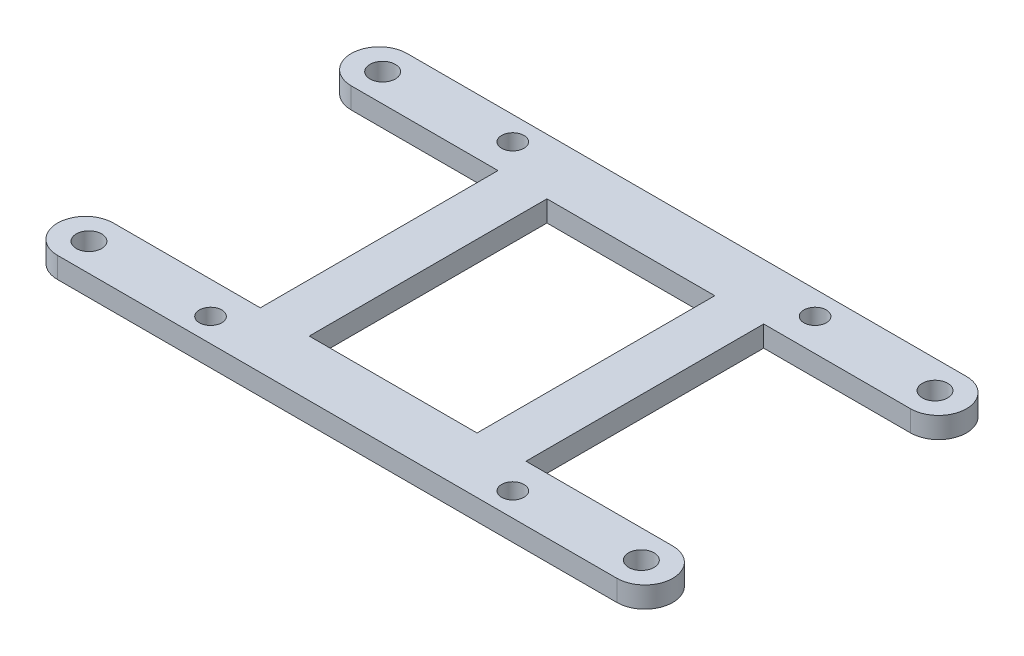
ISO-10303-21;
HEADER;
FILE_DESCRIPTION(('STEP AP214'),'2;1');
FILE_NAME('part.step','',(''),(''),'','','');
FILE_SCHEMA(('AUTOMOTIVE_DESIGN { 1 0 10303 214 1 1 1 1 }'));
ENDSEC;
DATA;
#1=APPLICATION_CONTEXT('core data for automotive mechanical design processes');
#2=APPLICATION_PROTOCOL_DEFINITION('international standard','automotive_design',2000,#1);
#3=PRODUCT_CONTEXT('',#1,'mechanical');
#4=PRODUCT('Part','Part','',(#3));
#5=PRODUCT_RELATED_PRODUCT_CATEGORY('part','',(#4));
#6=PRODUCT_DEFINITION_FORMATION('','',#4);
#7=PRODUCT_DEFINITION_CONTEXT('part definition',#1,'design');
#8=PRODUCT_DEFINITION('design','',#6,#7);
#9=PRODUCT_DEFINITION_SHAPE('','',#8);
#10=(LENGTH_UNIT() NAMED_UNIT(*) SI_UNIT(.MILLI.,.METRE.));
#11=(NAMED_UNIT(*) PLANE_ANGLE_UNIT() SI_UNIT($,.RADIAN.));
#12=(NAMED_UNIT(*) SI_UNIT($,.STERADIAN.) SOLID_ANGLE_UNIT());
#13=UNCERTAINTY_MEASURE_WITH_UNIT(LENGTH_MEASURE(1.E-05),#10,'distance_accuracy_value','');
#14=(GEOMETRIC_REPRESENTATION_CONTEXT(3) GLOBAL_UNCERTAINTY_ASSIGNED_CONTEXT((#13)) GLOBAL_UNIT_ASSIGNED_CONTEXT((#10,
#11,#12)) REPRESENTATION_CONTEXT('',''));
#15=CARTESIAN_POINT('',(0.,0.,0.));
#16=DIRECTION('',(0.,0.,1.));
#17=DIRECTION('',(1.,0.,0.));
#18=AXIS2_PLACEMENT_3D('',#15,#16,#17);
#19=CARTESIAN_POINT('',(12.,3.,0.));
#20=DIRECTION('',(-1.,0.,0.));
#21=DIRECTION('',(0.,0.,1.));
#22=AXIS2_PLACEMENT_3D('',#19,#20,#21);
#23=PLANE('',#22);
#24=DIRECTION('',(0.,0.,-1.));
#25=VECTOR('',#24,1.);
#26=CARTESIAN_POINT('',(12.,0.,0.));
#27=LINE('',#26,#25);
#28=CARTESIAN_POINT('',(12.0000000000001,0.,16.9999999999999));
#29=VERTEX_POINT('',#28);
#30=CARTESIAN_POINT('',(11.9999999999999,0.,-17.0000000000001));
#31=VERTEX_POINT('',#30);
#32=EDGE_CURVE('E251',#29,#31,#27,.T.);
#33=ORIENTED_EDGE('',*,*,#32,.F.);
#34=DIRECTION('',(0.,-1.,0.));
#35=VECTOR('',#34,1.);
#36=CARTESIAN_POINT('',(12.0000000000001,3.,16.9999999999999));
#37=LINE('',#36,#35);
#38=CARTESIAN_POINT('',(12.0000000000001,3.,16.9999999999999));
#39=VERTEX_POINT('',#38);
#40=EDGE_CURVE('E11',#39,#29,#37,.T.);
#41=ORIENTED_EDGE('',*,*,#40,.F.);
#42=DIRECTION('',(0.,0.,-1.));
#43=VECTOR('',#42,1.);
#44=CARTESIAN_POINT('',(12.,3.,0.));
#45=LINE('',#44,#43);
#46=CARTESIAN_POINT('',(11.9999999999999,3.,-17.0000000000001));
#47=VERTEX_POINT('',#46);
#48=EDGE_CURVE('E183',#39,#47,#45,.T.);
#49=ORIENTED_EDGE('',*,*,#48,.T.);
#50=DIRECTION('',(0.,-1.,0.));
#51=VECTOR('',#50,1.);
#52=CARTESIAN_POINT('',(11.9999999999999,3.,-17.0000000000001));
#53=LINE('',#52,#51);
#54=EDGE_CURVE('E121',#47,#31,#53,.T.);
#55=ORIENTED_EDGE('',*,*,#54,.T.);
#56=EDGE_LOOP('',(#33,#41,#49,#55));
#57=FACE_BOUND('',#56,.T.);
#58=ADVANCED_FACE('F43',(#57),#23,.T.);
#59=CARTESIAN_POINT('',(1.17961196366423E-13,3.,17.));
#60=DIRECTION('',(0.,0.,-1.));
#61=DIRECTION('',(-1.,0.,0.));
#62=AXIS2_PLACEMENT_3D('',#59,#60,#61);
#63=PLANE('',#62);
#64=DIRECTION('',(1.,0.,0.));
#65=VECTOR('',#64,1.);
#66=CARTESIAN_POINT('',(1.17961196366423E-13,0.,17.));
#67=LINE('',#66,#65);
#68=CARTESIAN_POINT('',(-11.9999999999999,0.,17.0000000000001));
#69=VERTEX_POINT('',#68);
#70=EDGE_CURVE('E173',#69,#29,#67,.T.);
#71=ORIENTED_EDGE('',*,*,#70,.F.);
#72=DIRECTION('',(0.,-1.,0.));
#73=VECTOR('',#72,1.);
#74=CARTESIAN_POINT('',(-11.9999999999999,3.,17.0000000000001));
#75=LINE('',#74,#73);
#76=CARTESIAN_POINT('',(-11.9999999999999,3.,17.0000000000001));
#77=VERTEX_POINT('',#76);
#78=EDGE_CURVE('E53',#77,#69,#75,.T.);
#79=ORIENTED_EDGE('',*,*,#78,.F.);
#80=DIRECTION('',(1.,0.,0.));
#81=VECTOR('',#80,1.);
#82=CARTESIAN_POINT('',(1.17961196366423E-13,3.,17.));
#83=LINE('',#82,#81);
#84=EDGE_CURVE('E171',#77,#39,#83,.T.);
#85=ORIENTED_EDGE('',*,*,#84,.T.);
#86=ORIENTED_EDGE('',*,*,#40,.T.);
#87=EDGE_LOOP('',(#71,#79,#85,#86));
#88=FACE_BOUND('',#87,.T.);
#89=ADVANCED_FACE('F169',(#88),#63,.T.);
#90=CARTESIAN_POINT('',(-11.9999999999999,3.,0.));
#91=DIRECTION('',(-1.,0.,0.));
#92=DIRECTION('',(0.,0.,1.));
#93=AXIS2_PLACEMENT_3D('',#90,#91,#92);
#94=PLANE('',#93);
#95=DIRECTION('',(0.,0.,-1.));
#96=VECTOR('',#95,1.);
#97=CARTESIAN_POINT('',(-11.9999999999999,0.,0.));
#98=LINE('',#97,#96);
#99=CARTESIAN_POINT('',(-12.,0.,-17.));
#100=VERTEX_POINT('',#99);
#101=EDGE_CURVE('E254',#69,#100,#98,.T.);
#102=ORIENTED_EDGE('',*,*,#101,.T.);
#103=DIRECTION('',(0.,-1.,0.));
#104=VECTOR('',#103,1.);
#105=CARTESIAN_POINT('',(-12.,3.,-17.));
#106=LINE('',#105,#104);
#107=CARTESIAN_POINT('',(-12.,3.,-17.));
#108=VERTEX_POINT('',#107);
#109=EDGE_CURVE('E176',#108,#100,#106,.T.);
#110=ORIENTED_EDGE('',*,*,#109,.F.);
#111=DIRECTION('',(0.,0.,-1.));
#112=VECTOR('',#111,1.);
#113=CARTESIAN_POINT('',(-11.9999999999999,3.,0.));
#114=LINE('',#113,#112);
#115=EDGE_CURVE('E179',#77,#108,#114,.T.);
#116=ORIENTED_EDGE('',*,*,#115,.F.);
#117=ORIENTED_EDGE('',*,*,#78,.T.);
#118=EDGE_LOOP('',(#102,#110,#116,#117));
#119=FACE_BOUND('',#118,.T.);
#120=ADVANCED_FACE('F180',(#119),#94,.F.);
#121=CARTESIAN_POINT('',(-40.000000000001,3.,21.0000000000001));
#122=DIRECTION('',(0.,-1.,0.));
#123=DIRECTION('',(0.,0.,-1.));
#124=AXIS2_PLACEMENT_3D('',#121,#122,#123);
#125=CYLINDRICAL_SURFACE('',#124,4.00000000000006);
#126=CARTESIAN_POINT('',(-40.000000000001,0.,21.0000000000001));
#127=DIRECTION('',(0.,1.,0.));
#128=DIRECTION('',(0.,0.,1.));
#129=AXIS2_PLACEMENT_3D('',#126,#127,#128);
#130=CIRCLE('',#129,4.00000000000006);
#131=CARTESIAN_POINT('',(-40.0000000000012,0.,24.9999999999998));
#132=VERTEX_POINT('',#131);
#133=CARTESIAN_POINT('',(-40.000000000001,0.,16.9999999999997));
#134=VERTEX_POINT('',#133);
#135=EDGE_CURVE('E215',#132,#134,#130,.F.);
#136=ORIENTED_EDGE('',*,*,#135,.F.);
#137=DIRECTION('',(0.,-1.,0.));
#138=VECTOR('',#137,1.);
#139=CARTESIAN_POINT('',(-40.0000000000012,3.,24.9999999999998));
#140=LINE('',#139,#138);
#141=CARTESIAN_POINT('',(-40.0000000000012,3.,24.9999999999998));
#142=VERTEX_POINT('',#141);
#143=EDGE_CURVE('E47',#142,#132,#140,.T.);
#144=ORIENTED_EDGE('',*,*,#143,.F.);
#145=CARTESIAN_POINT('',(-40.000000000001,3.,21.0000000000001));
#146=DIRECTION('',(0.,1.,0.));
#147=DIRECTION('',(0.,0.,1.));
#148=AXIS2_PLACEMENT_3D('',#145,#146,#147);
#149=CIRCLE('',#148,4.00000000000006);
#150=CARTESIAN_POINT('',(-40.000000000001,3.,16.9999999999997));
#151=VERTEX_POINT('',#150);
#152=EDGE_CURVE('E294',#142,#151,#149,.F.);
#153=ORIENTED_EDGE('',*,*,#152,.T.);
#154=DIRECTION('',(0.,-1.,0.));
#155=VECTOR('',#154,1.);
#156=CARTESIAN_POINT('',(-40.000000000001,3.,16.9999999999997));
#157=LINE('',#156,#155);
#158=EDGE_CURVE('E190',#151,#134,#157,.T.);
#159=ORIENTED_EDGE('',*,*,#158,.T.);
#160=EDGE_LOOP('',(#136,#144,#153,#159));
#161=FACE_BOUND('',#160,.T.);
#162=ADVANCED_FACE('F293',(#161),#125,.T.);
#163=CARTESIAN_POINT('',(-2.14775287501877E-13,3.,25.0000000000002));
#164=DIRECTION('',(0.,0.,-1.));
#165=DIRECTION('',(-1.,0.,0.));
#166=AXIS2_PLACEMENT_3D('',#163,#164,#165);
#167=PLANE('',#166);
#168=DIRECTION('',(1.,0.,0.));
#169=VECTOR('',#168,1.);
#170=CARTESIAN_POINT('',(-2.14775287501877E-13,0.,25.0000000000002));
#171=LINE('',#170,#169);
#172=CARTESIAN_POINT('',(40.0000000000012,0.,24.9999999999998));
#173=VERTEX_POINT('',#172);
#174=EDGE_CURVE('E218',#132,#173,#171,.T.);
#175=ORIENTED_EDGE('',*,*,#174,.T.);
#176=DIRECTION('',(0.,-1.,0.));
#177=VECTOR('',#176,1.);
#178=CARTESIAN_POINT('',(40.0000000000012,3.,24.9999999999998));
#179=LINE('',#178,#177);
#180=CARTESIAN_POINT('',(40.0000000000012,3.,24.9999999999998));
#181=VERTEX_POINT('',#180);
#182=EDGE_CURVE('E280',#181,#173,#179,.T.);
#183=ORIENTED_EDGE('',*,*,#182,.F.);
#184=DIRECTION('',(1.,0.,0.));
#185=VECTOR('',#184,1.);
#186=CARTESIAN_POINT('',(-2.14775287501877E-13,3.,25.0000000000002));
#187=LINE('',#186,#185);
#188=EDGE_CURVE('E288',#142,#181,#187,.T.);
#189=ORIENTED_EDGE('',*,*,#188,.F.);
#190=ORIENTED_EDGE('',*,*,#143,.T.);
#191=EDGE_LOOP('',(#175,#183,#189,#190));
#192=FACE_BOUND('',#191,.T.);
#193=ADVANCED_FACE('F286',(#192),#167,.F.);
#194=CARTESIAN_POINT('',(40.000000000001,3.,21.0000000000001));
#195=DIRECTION('',(0.,-1.,0.));
#196=DIRECTION('',(0.,0.,-1.));
#197=AXIS2_PLACEMENT_3D('',#194,#195,#196);
#198=CYLINDRICAL_SURFACE('',#197,4.00000000000006);
#199=CARTESIAN_POINT('',(40.000000000001,0.,21.0000000000001));
#200=DIRECTION('',(0.,1.,0.));
#201=DIRECTION('',(0.,0.,1.));
#202=AXIS2_PLACEMENT_3D('',#199,#200,#201);
#203=CIRCLE('',#202,4.00000000000006);
#204=CARTESIAN_POINT('',(40.000000000001,0.,16.9999999999997));
#205=VERTEX_POINT('',#204);
#206=EDGE_CURVE('E221',#173,#205,#203,.T.);
#207=ORIENTED_EDGE('',*,*,#206,.T.);
#208=DIRECTION('',(0.,-1.,0.));
#209=VECTOR('',#208,1.);
#210=CARTESIAN_POINT('',(40.000000000001,3.,16.9999999999997));
#211=LINE('',#210,#209);
#212=CARTESIAN_POINT('',(40.000000000001,3.,16.9999999999997));
#213=VERTEX_POINT('',#212);
#214=EDGE_CURVE('E279',#213,#205,#211,.T.);
#215=ORIENTED_EDGE('',*,*,#214,.F.);
#216=CARTESIAN_POINT('',(40.000000000001,3.,21.0000000000001));
#217=DIRECTION('',(0.,1.,0.));
#218=DIRECTION('',(0.,0.,1.));
#219=AXIS2_PLACEMENT_3D('',#216,#217,#218);
#220=CIRCLE('',#219,4.00000000000006);
#221=EDGE_CURVE('E691',#181,#213,#220,.T.);
#222=ORIENTED_EDGE('',*,*,#221,.F.);
#223=ORIENTED_EDGE('',*,*,#182,.T.);
#224=EDGE_LOOP('',(#207,#215,#222,#223));
#225=FACE_BOUND('',#224,.T.);
#226=ADVANCED_FACE('F344',(#225),#198,.T.);
#227=CARTESIAN_POINT('',(-3.3984058953181E-13,3.,16.9999999999989));
#228=DIRECTION('',(0.,0.,-1.));
#229=DIRECTION('',(-1.,0.,0.));
#230=AXIS2_PLACEMENT_3D('',#227,#228,#229);
#231=PLANE('',#230);
#232=DIRECTION('',(1.,0.,0.));
#233=VECTOR('',#232,1.);
#234=CARTESIAN_POINT('',(-3.3984058953181E-13,0.,16.9999999999989));
#235=LINE('',#234,#233);
#236=CARTESIAN_POINT('',(19.0000000000006,0.,16.9999999999993));
#237=VERTEX_POINT('',#236);
#238=EDGE_CURVE('E224',#237,#205,#235,.T.);
#239=ORIENTED_EDGE('',*,*,#238,.F.);
#240=DIRECTION('',(0.,-1.,0.));
#241=VECTOR('',#240,1.);
#242=CARTESIAN_POINT('',(19.0000000000006,3.,16.9999999999993));
#243=LINE('',#242,#241);
#244=CARTESIAN_POINT('',(19.0000000000006,3.,16.9999999999993));
#245=VERTEX_POINT('',#244);
#246=EDGE_CURVE('E277',#245,#237,#243,.T.);
#247=ORIENTED_EDGE('',*,*,#246,.F.);
#248=DIRECTION('',(1.,0.,0.));
#249=VECTOR('',#248,1.);
#250=CARTESIAN_POINT('',(-3.3984058953181E-13,3.,16.9999999999989));
#251=LINE('',#250,#249);
#252=EDGE_CURVE('E342',#245,#213,#251,.T.);
#253=ORIENTED_EDGE('',*,*,#252,.T.);
#254=ORIENTED_EDGE('',*,*,#214,.T.);
#255=EDGE_LOOP('',(#239,#247,#253,#254));
#256=FACE_BOUND('',#255,.T.);
#257=ADVANCED_FACE('F341',(#256),#231,.T.);
#258=CARTESIAN_POINT('',(19.0000000000006,3.,0.));
#259=DIRECTION('',(-1.,0.,0.));
#260=DIRECTION('',(0.,0.,1.));
#261=AXIS2_PLACEMENT_3D('',#258,#259,#260);
#262=PLANE('',#261);
#263=DIRECTION('',(0.,0.,-1.));
#264=VECTOR('',#263,1.);
#265=CARTESIAN_POINT('',(19.0000000000006,0.,0.));
#266=LINE('',#265,#264);
#267=CARTESIAN_POINT('',(19.0000000000006,0.,-17.0000000000001));
#268=VERTEX_POINT('',#267);
#269=EDGE_CURVE('E227',#237,#268,#266,.T.);
#270=ORIENTED_EDGE('',*,*,#269,.T.);
#271=DIRECTION('',(0.,-1.,0.));
#272=VECTOR('',#271,1.);
#273=CARTESIAN_POINT('',(19.0000000000006,3.,-17.0000000000001));
#274=LINE('',#273,#272);
#275=CARTESIAN_POINT('',(19.0000000000006,3.,-17.0000000000001));
#276=VERTEX_POINT('',#275);
#277=EDGE_CURVE('E274',#276,#268,#274,.T.);
#278=ORIENTED_EDGE('',*,*,#277,.F.);
#279=DIRECTION('',(0.,0.,-1.));
#280=VECTOR('',#279,1.);
#281=CARTESIAN_POINT('',(19.0000000000006,3.,0.));
#282=LINE('',#281,#280);
#283=EDGE_CURVE('E337',#245,#276,#282,.T.);
#284=ORIENTED_EDGE('',*,*,#283,.F.);
#285=ORIENTED_EDGE('',*,*,#246,.T.);
#286=EDGE_LOOP('',(#270,#278,#284,#285));
#287=FACE_BOUND('',#286,.T.);
#288=ADVANCED_FACE('F336',(#287),#262,.F.);
#289=CARTESIAN_POINT('',(3.22988990050923E-13,3.,-17.0000000000005));
#290=DIRECTION('',(0.,0.,-1.));
#291=DIRECTION('',(-1.,0.,0.));
#292=AXIS2_PLACEMENT_3D('',#289,#290,#291);
#293=PLANE('',#292);
#294=DIRECTION('',(1.,0.,0.));
#295=VECTOR('',#294,1.);
#296=CARTESIAN_POINT('',(3.22988990050923E-13,0.,-17.0000000000005));
#297=LINE('',#296,#295);
#298=CARTESIAN_POINT('',(40.000000000001,0.,-16.9999999999997));
#299=VERTEX_POINT('',#298);
#300=EDGE_CURVE('E230',#268,#299,#297,.T.);
#301=ORIENTED_EDGE('',*,*,#300,.T.);
#302=DIRECTION('',(0.,-1.,0.));
#303=VECTOR('',#302,1.);
#304=CARTESIAN_POINT('',(40.000000000001,3.,-16.9999999999997));
#305=LINE('',#304,#303);
#306=CARTESIAN_POINT('',(40.000000000001,3.,-16.9999999999997));
#307=VERTEX_POINT('',#306);
#308=EDGE_CURVE('E272',#307,#299,#305,.T.);
#309=ORIENTED_EDGE('',*,*,#308,.F.);
#310=DIRECTION('',(1.,0.,0.));
#311=VECTOR('',#310,1.);
#312=CARTESIAN_POINT('',(3.22988990050923E-13,3.,-17.0000000000005));
#313=LINE('',#312,#311);
#314=EDGE_CURVE('E332',#276,#307,#313,.T.);
#315=ORIENTED_EDGE('',*,*,#314,.F.);
#316=ORIENTED_EDGE('',*,*,#277,.T.);
#317=EDGE_LOOP('',(#301,#309,#315,#316));
#318=FACE_BOUND('',#317,.T.);
#319=ADVANCED_FACE('F331',(#318),#293,.F.);
#320=CARTESIAN_POINT('',(40.000000000001,3.,-21.0000000000001));
#321=DIRECTION('',(0.,-1.,0.));
#322=DIRECTION('',(0.,0.,-1.));
#323=AXIS2_PLACEMENT_3D('',#320,#321,#322);
#324=CYLINDRICAL_SURFACE('',#323,4.00000000000006);
#325=CARTESIAN_POINT('',(40.000000000001,0.,-21.0000000000001));
#326=DIRECTION('',(0.,1.,0.));
#327=DIRECTION('',(0.,0.,1.));
#328=AXIS2_PLACEMENT_3D('',#325,#326,#327);
#329=CIRCLE('',#328,4.00000000000006);
#330=CARTESIAN_POINT('',(40.0000000000012,0.,-24.9999999999999));
#331=VERTEX_POINT('',#330);
#332=EDGE_CURVE('E233',#331,#299,#329,.F.);
#333=ORIENTED_EDGE('',*,*,#332,.F.);
#334=DIRECTION('',(0.,-1.,0.));
#335=VECTOR('',#334,1.);
#336=CARTESIAN_POINT('',(40.0000000000012,3.,-24.9999999999999));
#337=LINE('',#336,#335);
#338=CARTESIAN_POINT('',(40.0000000000012,3.,-24.9999999999999));
#339=VERTEX_POINT('',#338);
#340=EDGE_CURVE('E270',#339,#331,#337,.T.);
#341=ORIENTED_EDGE('',*,*,#340,.F.);
#342=CARTESIAN_POINT('',(40.000000000001,3.,-21.0000000000001));
#343=DIRECTION('',(0.,1.,0.));
#344=DIRECTION('',(0.,0.,1.));
#345=AXIS2_PLACEMENT_3D('',#342,#343,#344);
#346=CIRCLE('',#345,4.00000000000006);
#347=EDGE_CURVE('E700',#339,#307,#346,.F.);
#348=ORIENTED_EDGE('',*,*,#347,.T.);
#349=ORIENTED_EDGE('',*,*,#308,.T.);
#350=EDGE_LOOP('',(#333,#341,#348,#349));
#351=FACE_BOUND('',#350,.T.);
#352=ADVANCED_FACE('F325',(#351),#324,.T.);
#353=CARTESIAN_POINT('',(4.70853514907973E-13,3.,-25.0000000000006));
#354=DIRECTION('',(0.,0.,-1.));
#355=DIRECTION('',(-1.,0.,0.));
#356=AXIS2_PLACEMENT_3D('',#353,#354,#355);
#357=PLANE('',#356);
#358=DIRECTION('',(1.,0.,0.));
#359=VECTOR('',#358,1.);
#360=CARTESIAN_POINT('',(4.70853514907973E-13,0.,-25.0000000000006));
#361=LINE('',#360,#359);
#362=CARTESIAN_POINT('',(-40.0000000000012,0.,-24.9999999999998));
#363=VERTEX_POINT('',#362);
#364=EDGE_CURVE('E236',#363,#331,#361,.T.);
#365=ORIENTED_EDGE('',*,*,#364,.F.);
#366=DIRECTION('',(0.,-1.,0.));
#367=VECTOR('',#366,1.);
#368=CARTESIAN_POINT('',(-40.0000000000012,3.,-24.9999999999998));
#369=LINE('',#368,#367);
#370=CARTESIAN_POINT('',(-40.0000000000012,3.,-24.9999999999998));
#371=VERTEX_POINT('',#370);
#372=EDGE_CURVE('E268',#371,#363,#369,.T.);
#373=ORIENTED_EDGE('',*,*,#372,.F.);
#374=DIRECTION('',(1.,0.,0.));
#375=VECTOR('',#374,1.);
#376=CARTESIAN_POINT('',(4.70853514907973E-13,3.,-25.0000000000006));
#377=LINE('',#376,#375);
#378=EDGE_CURVE('E321',#371,#339,#377,.T.);
#379=ORIENTED_EDGE('',*,*,#378,.T.);
#380=ORIENTED_EDGE('',*,*,#340,.T.);
#381=EDGE_LOOP('',(#365,#373,#379,#380));
#382=FACE_BOUND('',#381,.T.);
#383=ADVANCED_FACE('F317',(#382),#357,.T.);
#384=CARTESIAN_POINT('',(-40.000000000001,3.,-21.0000000000001));
#385=DIRECTION('',(0.,-1.,0.));
#386=DIRECTION('',(0.,0.,-1.));
#387=AXIS2_PLACEMENT_3D('',#384,#385,#386);
#388=CYLINDRICAL_SURFACE('',#387,4.00000000000006);
#389=CARTESIAN_POINT('',(-40.000000000001,0.,-21.0000000000001));
#390=DIRECTION('',(0.,1.,0.));
#391=DIRECTION('',(0.,0.,1.));
#392=AXIS2_PLACEMENT_3D('',#389,#390,#391);
#393=CIRCLE('',#392,4.00000000000006);
#394=CARTESIAN_POINT('',(-40.000000000001,0.,-16.9999999999997));
#395=VERTEX_POINT('',#394);
#396=EDGE_CURVE('E239',#363,#395,#393,.T.);
#397=ORIENTED_EDGE('',*,*,#396,.T.);
#398=DIRECTION('',(0.,-1.,0.));
#399=VECTOR('',#398,1.);
#400=CARTESIAN_POINT('',(-40.000000000001,3.,-16.9999999999997));
#401=LINE('',#400,#399);
#402=CARTESIAN_POINT('',(-40.000000000001,3.,-16.9999999999997));
#403=VERTEX_POINT('',#402);
#404=EDGE_CURVE('E265',#403,#395,#401,.T.);
#405=ORIENTED_EDGE('',*,*,#404,.F.);
#406=CARTESIAN_POINT('',(-40.000000000001,3.,-21.0000000000001));
#407=DIRECTION('',(0.,1.,0.));
#408=DIRECTION('',(0.,0.,1.));
#409=AXIS2_PLACEMENT_3D('',#406,#407,#408);
#410=CIRCLE('',#409,4.00000000000006);
#411=EDGE_CURVE('E703',#371,#403,#410,.T.);
#412=ORIENTED_EDGE('',*,*,#411,.F.);
#413=ORIENTED_EDGE('',*,*,#372,.T.);
#414=EDGE_LOOP('',(#397,#405,#412,#413));
#415=FACE_BOUND('',#414,.T.);
#416=ADVANCED_FACE('F314',(#415),#388,.T.);
#417=CARTESIAN_POINT('',(-3.45457789358789E-13,3.,-17.0000000000005));
#418=DIRECTION('',(0.,0.,-1.));
#419=DIRECTION('',(-1.,0.,0.));
#420=AXIS2_PLACEMENT_3D('',#417,#418,#419);
#421=PLANE('',#420);
#422=DIRECTION('',(1.,0.,0.));
#423=VECTOR('',#422,1.);
#424=CARTESIAN_POINT('',(-3.45457789358789E-13,0.,-17.0000000000005));
#425=LINE('',#424,#423);
#426=CARTESIAN_POINT('',(-18.9999999999991,0.,-17.0000000000002));
#427=VERTEX_POINT('',#426);
#428=EDGE_CURVE('E242',#395,#427,#425,.T.);
#429=ORIENTED_EDGE('',*,*,#428,.T.);
#430=DIRECTION('',(0.,-1.,0.));
#431=VECTOR('',#430,1.);
#432=CARTESIAN_POINT('',(-18.9999999999991,3.,-17.0000000000002));
#433=LINE('',#432,#431);
#434=CARTESIAN_POINT('',(-18.9999999999991,3.,-17.0000000000002));
#435=VERTEX_POINT('',#434);
#436=EDGE_CURVE('E263',#435,#427,#433,.T.);
#437=ORIENTED_EDGE('',*,*,#436,.F.);
#438=DIRECTION('',(1.,0.,0.));
#439=VECTOR('',#438,1.);
#440=CARTESIAN_POINT('',(-3.45457789358789E-13,3.,-17.0000000000005));
#441=LINE('',#440,#439);
#442=EDGE_CURVE('E310',#403,#435,#441,.T.);
#443=ORIENTED_EDGE('',*,*,#442,.F.);
#444=ORIENTED_EDGE('',*,*,#404,.T.);
#445=EDGE_LOOP('',(#429,#437,#443,#444));
#446=FACE_BOUND('',#445,.T.);
#447=ADVANCED_FACE('F308',(#446),#421,.F.);
#448=CARTESIAN_POINT('',(-18.9999999999991,3.,0.));
#449=DIRECTION('',(-1.,0.,0.));
#450=DIRECTION('',(0.,0.,1.));
#451=AXIS2_PLACEMENT_3D('',#448,#449,#450);
#452=PLANE('',#451);
#453=DIRECTION('',(0.,0.,-1.));
#454=VECTOR('',#453,1.);
#455=CARTESIAN_POINT('',(-18.9999999999991,0.,0.));
#456=LINE('',#455,#454);
#457=CARTESIAN_POINT('',(-18.9999999999991,0.,16.9999999999996));
#458=VERTEX_POINT('',#457);
#459=EDGE_CURVE('E245',#458,#427,#456,.T.);
#460=ORIENTED_EDGE('',*,*,#459,.F.);
#461=DIRECTION('',(0.,-1.,0.));
#462=VECTOR('',#461,1.);
#463=CARTESIAN_POINT('',(-18.9999999999991,3.,16.9999999999996));
#464=LINE('',#463,#462);
#465=CARTESIAN_POINT('',(-18.9999999999991,3.,16.9999999999996));
#466=VERTEX_POINT('',#465);
#467=EDGE_CURVE('E261',#466,#458,#464,.T.);
#468=ORIENTED_EDGE('',*,*,#467,.F.);
#469=DIRECTION('',(0.,0.,-1.));
#470=VECTOR('',#469,1.);
#471=CARTESIAN_POINT('',(-18.9999999999991,3.,0.));
#472=LINE('',#471,#470);
#473=EDGE_CURVE('E306',#466,#435,#472,.T.);
#474=ORIENTED_EDGE('',*,*,#473,.T.);
#475=ORIENTED_EDGE('',*,*,#436,.T.);
#476=EDGE_LOOP('',(#460,#468,#474,#475));
#477=FACE_BOUND('',#476,.T.);
#478=ADVANCED_FACE('F302',(#477),#452,.T.);
#479=CARTESIAN_POINT('',(1.17961196366408E-13,3.,16.9999999999994));
#480=DIRECTION('',(0.,0.,-1.));
#481=DIRECTION('',(-1.,0.,0.));
#482=AXIS2_PLACEMENT_3D('',#479,#480,#481);
#483=PLANE('',#482);
#484=DIRECTION('',(1.,0.,0.));
#485=VECTOR('',#484,1.);
#486=CARTESIAN_POINT('',(1.17961196366408E-13,0.,16.9999999999994));
#487=LINE('',#486,#485);
#488=EDGE_CURVE('E248',#134,#458,#487,.T.);
#489=ORIENTED_EDGE('',*,*,#488,.F.);
#490=ORIENTED_EDGE('',*,*,#158,.F.);
#491=DIRECTION('',(1.,0.,0.));
#492=VECTOR('',#491,1.);
#493=CARTESIAN_POINT('',(1.17961196366408E-13,3.,16.9999999999994));
#494=LINE('',#493,#492);
#495=EDGE_CURVE('E185',#151,#466,#494,.T.);
#496=ORIENTED_EDGE('',*,*,#495,.T.);
#497=ORIENTED_EDGE('',*,*,#467,.T.);
#498=EDGE_LOOP('',(#489,#490,#496,#497));
#499=FACE_BOUND('',#498,.T.);
#500=ADVANCED_FACE('F298',(#499),#483,.T.);
#501=CARTESIAN_POINT('',(-39.5,3.,21.0000000000001));
#502=DIRECTION('',(0.,-1.,0.));
#503=DIRECTION('',(0.,0.,-1.));
#504=AXIS2_PLACEMENT_3D('',#501,#502,#503);
#505=CYLINDRICAL_SURFACE('',#504,1.81722688352686);
#506=CARTESIAN_POINT('',(-39.5,3.,21.0000000000001));
#507=DIRECTION('',(0.,1.,0.));
#508=DIRECTION('',(0.,0.,1.));
#509=AXIS2_PLACEMENT_3D('',#506,#507,#508);
#510=CIRCLE('',#509,1.81722688352686);
#511=CARTESIAN_POINT('',(-39.5,3.,22.8172268835269));
#512=VERTEX_POINT('',#511);
#513=EDGE_CURVE('E689',#512,#512,#510,.T.);
#514=ORIENTED_EDGE('',*,*,#513,.T.);
#515=EDGE_LOOP('',(#514));
#516=FACE_BOUND('',#515,.T.);
#517=CARTESIAN_POINT('',(-39.5,0.,21.0000000000001));
#518=DIRECTION('',(0.,1.,0.));
#519=DIRECTION('',(0.,0.,1.));
#520=AXIS2_PLACEMENT_3D('',#517,#518,#519);
#521=CIRCLE('',#520,1.81722688352686);
#522=CARTESIAN_POINT('',(-39.5,0.,22.8172268835269));
#523=VERTEX_POINT('',#522);
#524=EDGE_CURVE('E212',#523,#523,#521,.T.);
#525=ORIENTED_EDGE('',*,*,#524,.F.);
#526=EDGE_LOOP('',(#525));
#527=FACE_BOUND('',#526,.T.);
#528=ADVANCED_FACE('F363',(#516,#527),#505,.F.);
#529=CARTESIAN_POINT('',(39.5,3.,21.0000000000001));
#530=DIRECTION('',(0.,-1.,0.));
#531=DIRECTION('',(0.,0.,-1.));
#532=AXIS2_PLACEMENT_3D('',#529,#530,#531);
#533=CYLINDRICAL_SURFACE('',#532,1.81722688352686);
#534=CARTESIAN_POINT('',(39.5,3.,21.0000000000001));
#535=DIRECTION('',(0.,1.,0.));
#536=DIRECTION('',(0.,0.,1.));
#537=AXIS2_PLACEMENT_3D('',#534,#535,#536);
#538=CIRCLE('',#537,1.81722688352686);
#539=CARTESIAN_POINT('',(39.5,3.,22.8172268835269));
#540=VERTEX_POINT('',#539);
#541=EDGE_CURVE('E685',#540,#540,#538,.T.);
#542=ORIENTED_EDGE('',*,*,#541,.T.);
#543=EDGE_LOOP('',(#542));
#544=FACE_BOUND('',#543,.T.);
#545=CARTESIAN_POINT('',(39.5,0.,21.0000000000001));
#546=DIRECTION('',(0.,1.,0.));
#547=DIRECTION('',(0.,0.,1.));
#548=AXIS2_PLACEMENT_3D('',#545,#546,#547);
#549=CIRCLE('',#548,1.81722688352686);
#550=CARTESIAN_POINT('',(39.5,0.,22.8172268835269));
#551=VERTEX_POINT('',#550);
#552=EDGE_CURVE('E209',#551,#551,#549,.T.);
#553=ORIENTED_EDGE('',*,*,#552,.F.);
#554=EDGE_LOOP('',(#553));
#555=FACE_BOUND('',#554,.T.);
#556=ADVANCED_FACE('F415',(#544,#555),#533,.F.);
#557=CARTESIAN_POINT('',(39.4999999999999,3.,-21.));
#558=DIRECTION('',(0.,-1.,0.));
#559=DIRECTION('',(0.,0.,-1.));
#560=AXIS2_PLACEMENT_3D('',#557,#558,#559);
#561=CYLINDRICAL_SURFACE('',#560,1.81722688352686);
#562=CARTESIAN_POINT('',(39.4999999999999,3.,-21.));
#563=DIRECTION('',(0.,1.,0.));
#564=DIRECTION('',(0.,0.,1.));
#565=AXIS2_PLACEMENT_3D('',#562,#563,#564);
#566=CIRCLE('',#565,1.81722688352686);
#567=CARTESIAN_POINT('',(39.4999999999999,3.,-19.1827731164731));
#568=VERTEX_POINT('',#567);
#569=EDGE_CURVE('E681',#568,#568,#566,.T.);
#570=ORIENTED_EDGE('',*,*,#569,.T.);
#571=EDGE_LOOP('',(#570));
#572=FACE_BOUND('',#571,.T.);
#573=CARTESIAN_POINT('',(39.4999999999999,0.,-21.));
#574=DIRECTION('',(0.,1.,0.));
#575=DIRECTION('',(0.,0.,1.));
#576=AXIS2_PLACEMENT_3D('',#573,#574,#575);
#577=CIRCLE('',#576,1.81722688352686);
#578=CARTESIAN_POINT('',(39.4999999999999,0.,-19.1827731164731));
#579=VERTEX_POINT('',#578);
#580=EDGE_CURVE('E206',#579,#579,#577,.T.);
#581=ORIENTED_EDGE('',*,*,#580,.F.);
#582=EDGE_LOOP('',(#581));
#583=FACE_BOUND('',#582,.T.);
#584=ADVANCED_FACE('F423',(#572,#583),#561,.F.);
#585=CARTESIAN_POINT('',(-39.5000000000001,3.,-21.));
#586=DIRECTION('',(0.,-1.,0.));
#587=DIRECTION('',(0.,0.,-1.));
#588=AXIS2_PLACEMENT_3D('',#585,#586,#587);
#589=CYLINDRICAL_SURFACE('',#588,1.81722688352686);
#590=CARTESIAN_POINT('',(-39.5000000000001,3.,-21.));
#591=DIRECTION('',(0.,1.,0.));
#592=DIRECTION('',(0.,0.,1.));
#593=AXIS2_PLACEMENT_3D('',#590,#591,#592);
#594=CIRCLE('',#593,1.81722688352686);
#595=CARTESIAN_POINT('',(-39.5000000000001,3.,-19.1827731164731));
#596=VERTEX_POINT('',#595);
#597=EDGE_CURVE('E677',#596,#596,#594,.T.);
#598=ORIENTED_EDGE('',*,*,#597,.T.);
#599=EDGE_LOOP('',(#598));
#600=FACE_BOUND('',#599,.T.);
#601=CARTESIAN_POINT('',(-39.5000000000001,0.,-21.));
#602=DIRECTION('',(0.,1.,0.));
#603=DIRECTION('',(0.,0.,1.));
#604=AXIS2_PLACEMENT_3D('',#601,#602,#603);
#605=CIRCLE('',#604,1.81722688352686);
#606=CARTESIAN_POINT('',(-39.5000000000001,0.,-19.1827731164731));
#607=VERTEX_POINT('',#606);
#608=EDGE_CURVE('E203',#607,#607,#605,.T.);
#609=ORIENTED_EDGE('',*,*,#608,.F.);
#610=EDGE_LOOP('',(#609));
#611=FACE_BOUND('',#610,.T.);
#612=ADVANCED_FACE('F431',(#600,#611),#589,.F.);
#613=CARTESIAN_POINT('',(-21.5,3.,-21.615));
#614=DIRECTION('',(0.,-1.,0.));
#615=DIRECTION('',(0.,0.,-1.));
#616=AXIS2_PLACEMENT_3D('',#613,#614,#615);
#617=CYLINDRICAL_SURFACE('',#616,1.6);
#618=CARTESIAN_POINT('',(-21.5,3.,-21.615));
#619=DIRECTION('',(0.,1.,0.));
#620=DIRECTION('',(0.,0.,1.));
#621=AXIS2_PLACEMENT_3D('',#618,#619,#620);
#622=CIRCLE('',#621,1.6);
#623=CARTESIAN_POINT('',(-21.5,3.,-20.015));
#624=VERTEX_POINT('',#623);
#625=EDGE_CURVE('E673',#624,#624,#622,.T.);
#626=ORIENTED_EDGE('',*,*,#625,.T.);
#627=EDGE_LOOP('',(#626));
#628=FACE_BOUND('',#627,.T.);
#629=CARTESIAN_POINT('',(-21.5,0.,-21.615));
#630=DIRECTION('',(0.,1.,0.));
#631=DIRECTION('',(0.,0.,1.));
#632=AXIS2_PLACEMENT_3D('',#629,#630,#631);
#633=CIRCLE('',#632,1.6);
#634=CARTESIAN_POINT('',(-21.5,0.,-20.015));
#635=VERTEX_POINT('',#634);
#636=EDGE_CURVE('E200',#635,#635,#633,.T.);
#637=ORIENTED_EDGE('',*,*,#636,.F.);
#638=EDGE_LOOP('',(#637));
#639=FACE_BOUND('',#638,.T.);
#640=ADVANCED_FACE('F439',(#628,#639),#617,.F.);
#641=CARTESIAN_POINT('',(21.73,3.,-21.615));
#642=DIRECTION('',(0.,-1.,0.));
#643=DIRECTION('',(0.,0.,-1.));
#644=AXIS2_PLACEMENT_3D('',#641,#642,#643);
#645=CYLINDRICAL_SURFACE('',#644,1.6);
#646=CARTESIAN_POINT('',(21.73,3.,-21.615));
#647=DIRECTION('',(0.,1.,0.));
#648=DIRECTION('',(0.,0.,1.));
#649=AXIS2_PLACEMENT_3D('',#646,#647,#648);
#650=CIRCLE('',#649,1.6);
#651=CARTESIAN_POINT('',(21.73,3.,-20.015));
#652=VERTEX_POINT('',#651);
#653=EDGE_CURVE('E669',#652,#652,#650,.T.);
#654=ORIENTED_EDGE('',*,*,#653,.T.);
#655=EDGE_LOOP('',(#654));
#656=FACE_BOUND('',#655,.T.);
#657=CARTESIAN_POINT('',(21.73,0.,-21.615));
#658=DIRECTION('',(0.,1.,0.));
#659=DIRECTION('',(0.,0.,1.));
#660=AXIS2_PLACEMENT_3D('',#657,#658,#659);
#661=CIRCLE('',#660,1.6);
#662=CARTESIAN_POINT('',(21.73,0.,-20.015));
#663=VERTEX_POINT('',#662);
#664=EDGE_CURVE('E197',#663,#663,#661,.T.);
#665=ORIENTED_EDGE('',*,*,#664,.F.);
#666=EDGE_LOOP('',(#665));
#667=FACE_BOUND('',#666,.T.);
#668=ADVANCED_FACE('F447',(#656,#667),#645,.F.);
#669=CARTESIAN_POINT('',(21.7300000000005,3.,21.615));
#670=DIRECTION('',(0.,-1.,0.));
#671=DIRECTION('',(0.,0.,-1.));
#672=AXIS2_PLACEMENT_3D('',#669,#670,#671);
#673=CYLINDRICAL_SURFACE('',#672,1.6);
#674=CARTESIAN_POINT('',(21.7300000000005,3.,21.615));
#675=DIRECTION('',(0.,1.,0.));
#676=DIRECTION('',(0.,0.,1.));
#677=AXIS2_PLACEMENT_3D('',#674,#675,#676);
#678=CIRCLE('',#677,1.6);
#679=CARTESIAN_POINT('',(21.7300000000005,3.,23.215));
#680=VERTEX_POINT('',#679);
#681=EDGE_CURVE('E665',#680,#680,#678,.T.);
#682=ORIENTED_EDGE('',*,*,#681,.T.);
#683=EDGE_LOOP('',(#682));
#684=FACE_BOUND('',#683,.T.);
#685=CARTESIAN_POINT('',(21.7300000000005,0.,21.615));
#686=DIRECTION('',(0.,1.,0.));
#687=DIRECTION('',(0.,0.,1.));
#688=AXIS2_PLACEMENT_3D('',#685,#686,#687);
#689=CIRCLE('',#688,1.6);
#690=CARTESIAN_POINT('',(21.7300000000005,0.,23.215));
#691=VERTEX_POINT('',#690);
#692=EDGE_CURVE('E194',#691,#691,#689,.T.);
#693=ORIENTED_EDGE('',*,*,#692,.F.);
#694=EDGE_LOOP('',(#693));
#695=FACE_BOUND('',#694,.T.);
#696=ADVANCED_FACE('F455',(#684,#695),#673,.F.);
#697=CARTESIAN_POINT('',(-21.4999999999995,3.,21.615));
#698=DIRECTION('',(0.,-1.,0.));
#699=DIRECTION('',(0.,0.,-1.));
#700=AXIS2_PLACEMENT_3D('',#697,#698,#699);
#701=CYLINDRICAL_SURFACE('',#700,1.6);
#702=CARTESIAN_POINT('',(-21.4999999999995,3.,21.615));
#703=DIRECTION('',(0.,1.,0.));
#704=DIRECTION('',(0.,0.,1.));
#705=AXIS2_PLACEMENT_3D('',#702,#703,#704);
#706=CIRCLE('',#705,1.6);
#707=CARTESIAN_POINT('',(-21.4999999999995,3.,23.215));
#708=VERTEX_POINT('',#707);
#709=EDGE_CURVE('E257',#708,#708,#706,.T.);
#710=ORIENTED_EDGE('',*,*,#709,.T.);
#711=EDGE_LOOP('',(#710));
#712=FACE_BOUND('',#711,.T.);
#713=CARTESIAN_POINT('',(-21.4999999999995,0.,21.615));
#714=DIRECTION('',(0.,1.,0.));
#715=DIRECTION('',(0.,0.,1.));
#716=AXIS2_PLACEMENT_3D('',#713,#714,#715);
#717=CIRCLE('',#716,1.6);
#718=CARTESIAN_POINT('',(-21.4999999999995,0.,23.215));
#719=VERTEX_POINT('',#718);
#720=EDGE_CURVE('E191',#719,#719,#717,.T.);
#721=ORIENTED_EDGE('',*,*,#720,.F.);
#722=EDGE_LOOP('',(#721));
#723=FACE_BOUND('',#722,.T.);
#724=ADVANCED_FACE('F45',(#712,#723),#701,.F.);
#725=CARTESIAN_POINT('',(0.,3.,-17.));
#726=DIRECTION('',(0.,0.,-1.));
#727=DIRECTION('',(-1.,0.,0.));
#728=AXIS2_PLACEMENT_3D('',#725,#726,#727);
#729=PLANE('',#728);
#730=DIRECTION('',(1.,0.,0.));
#731=VECTOR('',#730,1.);
#732=CARTESIAN_POINT('',(0.,0.,-17.));
#733=LINE('',#732,#731);
#734=EDGE_CURVE('E114',#100,#31,#733,.T.);
#735=ORIENTED_EDGE('',*,*,#734,.T.);
#736=ORIENTED_EDGE('',*,*,#54,.F.);
#737=DIRECTION('',(1.,0.,0.));
#738=VECTOR('',#737,1.);
#739=CARTESIAN_POINT('',(0.,3.,-17.));
#740=LINE('',#739,#738);
#741=EDGE_CURVE('E62',#108,#47,#740,.T.);
#742=ORIENTED_EDGE('',*,*,#741,.F.);
#743=ORIENTED_EDGE('',*,*,#109,.T.);
#744=EDGE_LOOP('',(#735,#736,#742,#743));
#745=FACE_BOUND('',#744,.T.);
#746=ADVANCED_FACE('F469',(#745),#729,.F.);
#747=CARTESIAN_POINT('',(0.,3.,0.));
#748=DIRECTION('',(0.,1.,0.));
#749=DIRECTION('',(0.,0.,1.));
#750=AXIS2_PLACEMENT_3D('',#747,#748,#749);
#751=PLANE('',#750);
#752=ORIENTED_EDGE('',*,*,#709,.F.);
#753=EDGE_LOOP('',(#752));
#754=FACE_BOUND('',#753,.T.);
#755=ORIENTED_EDGE('',*,*,#681,.F.);
#756=EDGE_LOOP('',(#755));
#757=FACE_BOUND('',#756,.T.);
#758=ORIENTED_EDGE('',*,*,#653,.F.);
#759=EDGE_LOOP('',(#758));
#760=FACE_BOUND('',#759,.T.);
#761=ORIENTED_EDGE('',*,*,#625,.F.);
#762=EDGE_LOOP('',(#761));
#763=FACE_BOUND('',#762,.T.);
#764=ORIENTED_EDGE('',*,*,#597,.F.);
#765=EDGE_LOOP('',(#764));
#766=FACE_BOUND('',#765,.T.);
#767=ORIENTED_EDGE('',*,*,#569,.F.);
#768=EDGE_LOOP('',(#767));
#769=FACE_BOUND('',#768,.T.);
#770=ORIENTED_EDGE('',*,*,#541,.F.);
#771=EDGE_LOOP('',(#770));
#772=FACE_BOUND('',#771,.T.);
#773=ORIENTED_EDGE('',*,*,#513,.F.);
#774=EDGE_LOOP('',(#773));
#775=FACE_BOUND('',#774,.T.);
#776=ORIENTED_EDGE('',*,*,#152,.F.);
#777=ORIENTED_EDGE('',*,*,#188,.T.);
#778=ORIENTED_EDGE('',*,*,#221,.T.);
#779=ORIENTED_EDGE('',*,*,#252,.F.);
#780=ORIENTED_EDGE('',*,*,#283,.T.);
#781=ORIENTED_EDGE('',*,*,#314,.T.);
#782=ORIENTED_EDGE('',*,*,#347,.F.);
#783=ORIENTED_EDGE('',*,*,#378,.F.);
#784=ORIENTED_EDGE('',*,*,#411,.T.);
#785=ORIENTED_EDGE('',*,*,#442,.T.);
#786=ORIENTED_EDGE('',*,*,#473,.F.);
#787=ORIENTED_EDGE('',*,*,#495,.F.);
#788=EDGE_LOOP('',(#776,#777,#778,#779,#780,#781,#782,#783,#784,#785,#786,#787));
#789=FACE_BOUND('',#788,.T.);
#790=ORIENTED_EDGE('',*,*,#48,.F.);
#791=ORIENTED_EDGE('',*,*,#84,.F.);
#792=ORIENTED_EDGE('',*,*,#115,.T.);
#793=ORIENTED_EDGE('',*,*,#741,.T.);
#794=EDGE_LOOP('',(#790,#791,#792,#793));
#795=FACE_BOUND('',#794,.T.);
#796=ADVANCED_FACE('F182',(#754,#757,#760,#763,#766,#769,#772,#775,#789,#795),#751,.T.);
#797=CARTESIAN_POINT('',(0.,0.,0.));
#798=DIRECTION('',(0.,1.,0.));
#799=DIRECTION('',(0.,0.,1.));
#800=AXIS2_PLACEMENT_3D('',#797,#798,#799);
#801=PLANE('',#800);
#802=ORIENTED_EDGE('',*,*,#720,.T.);
#803=EDGE_LOOP('',(#802));
#804=FACE_BOUND('',#803,.T.);
#805=ORIENTED_EDGE('',*,*,#692,.T.);
#806=EDGE_LOOP('',(#805));
#807=FACE_BOUND('',#806,.T.);
#808=ORIENTED_EDGE('',*,*,#664,.T.);
#809=EDGE_LOOP('',(#808));
#810=FACE_BOUND('',#809,.T.);
#811=ORIENTED_EDGE('',*,*,#636,.T.);
#812=EDGE_LOOP('',(#811));
#813=FACE_BOUND('',#812,.T.);
#814=ORIENTED_EDGE('',*,*,#608,.T.);
#815=EDGE_LOOP('',(#814));
#816=FACE_BOUND('',#815,.T.);
#817=ORIENTED_EDGE('',*,*,#580,.T.);
#818=EDGE_LOOP('',(#817));
#819=FACE_BOUND('',#818,.T.);
#820=ORIENTED_EDGE('',*,*,#552,.T.);
#821=EDGE_LOOP('',(#820));
#822=FACE_BOUND('',#821,.T.);
#823=ORIENTED_EDGE('',*,*,#524,.T.);
#824=EDGE_LOOP('',(#823));
#825=FACE_BOUND('',#824,.T.);
#826=ORIENTED_EDGE('',*,*,#135,.T.);
#827=ORIENTED_EDGE('',*,*,#488,.T.);
#828=ORIENTED_EDGE('',*,*,#459,.T.);
#829=ORIENTED_EDGE('',*,*,#428,.F.);
#830=ORIENTED_EDGE('',*,*,#396,.F.);
#831=ORIENTED_EDGE('',*,*,#364,.T.);
#832=ORIENTED_EDGE('',*,*,#332,.T.);
#833=ORIENTED_EDGE('',*,*,#300,.F.);
#834=ORIENTED_EDGE('',*,*,#269,.F.);
#835=ORIENTED_EDGE('',*,*,#238,.T.);
#836=ORIENTED_EDGE('',*,*,#206,.F.);
#837=ORIENTED_EDGE('',*,*,#174,.F.);
#838=EDGE_LOOP('',(#826,#827,#828,#829,#830,#831,#832,#833,#834,#835,#836,#837));
#839=FACE_BOUND('',#838,.T.);
#840=ORIENTED_EDGE('',*,*,#32,.T.);
#841=ORIENTED_EDGE('',*,*,#734,.F.);
#842=ORIENTED_EDGE('',*,*,#101,.F.);
#843=ORIENTED_EDGE('',*,*,#70,.T.);
#844=EDGE_LOOP('',(#840,#841,#842,#843));
#845=FACE_BOUND('',#844,.T.);
#846=ADVANCED_FACE('F291',(#804,#807,#810,#813,#816,#819,#822,#825,#839,#845),#801,.F.);
#847=CLOSED_SHELL('',(#58,#89,#120,#162,#193,#226,#257,#288,#319,#352,#383,#416,#447,#478,#500,
#528,#556,#584,#612,#640,#668,#696,#724,#746,#796,#846));
#848=MANIFOLD_SOLID_BREP('B2',#847);
#849=ADVANCED_BREP_SHAPE_REPRESENTATION('',(#18,#848),#14);
#850=SHAPE_DEFINITION_REPRESENTATION(#9,#849);
ENDSEC;
END-ISO-10303-21;
